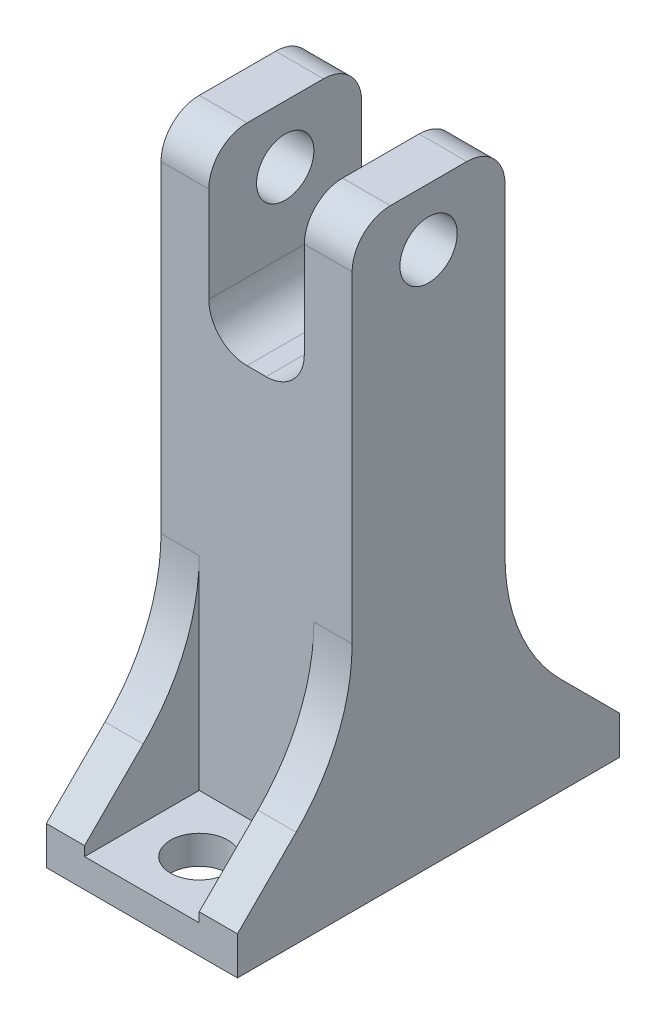
ISO-10303-21;
HEADER;
FILE_DESCRIPTION(('STEP AP214'),'2;1');
FILE_NAME('part.step','',(''),(''),'','','');
FILE_SCHEMA(('AUTOMOTIVE_DESIGN { 1 0 10303 214 1 1 1 1 }'));
ENDSEC;
DATA;
#1=APPLICATION_CONTEXT('core data for automotive mechanical design processes');
#2=APPLICATION_PROTOCOL_DEFINITION('international standard','automotive_design',2000,#1);
#3=PRODUCT_CONTEXT('',#1,'mechanical');
#4=PRODUCT('Part','Part','',(#3));
#5=PRODUCT_RELATED_PRODUCT_CATEGORY('part','',(#4));
#6=PRODUCT_DEFINITION_FORMATION('','',#4);
#7=PRODUCT_DEFINITION_CONTEXT('part definition',#1,'design');
#8=PRODUCT_DEFINITION('design','',#6,#7);
#9=PRODUCT_DEFINITION_SHAPE('','',#8);
#10=(LENGTH_UNIT() NAMED_UNIT(*) SI_UNIT(.MILLI.,.METRE.));
#11=(NAMED_UNIT(*) PLANE_ANGLE_UNIT() SI_UNIT($,.RADIAN.));
#12=(NAMED_UNIT(*) SI_UNIT($,.STERADIAN.) SOLID_ANGLE_UNIT());
#13=UNCERTAINTY_MEASURE_WITH_UNIT(LENGTH_MEASURE(1.E-05),#10,'distance_accuracy_value','');
#14=(GEOMETRIC_REPRESENTATION_CONTEXT(3) GLOBAL_UNCERTAINTY_ASSIGNED_CONTEXT((#13)) GLOBAL_UNIT_ASSIGNED_CONTEXT((#10,
#11,#12)) REPRESENTATION_CONTEXT('',''));
#15=CARTESIAN_POINT('',(0.,0.,0.));
#16=DIRECTION('',(0.,0.,1.));
#17=DIRECTION('',(1.,0.,0.));
#18=AXIS2_PLACEMENT_3D('',#15,#16,#17);
#19=CARTESIAN_POINT('',(5.,-13.5,10.));
#20=DIRECTION('',(0.,-0.707106781186548,-0.707106781186547));
#21=DIRECTION('',(0.,0.707106781186547,-0.707106781186548));
#22=AXIS2_PLACEMENT_3D('',#19,#20,#21);
#23=PLANE('',#22);
#24=DIRECTION('',(0.,0.707106781186547,-0.707106781186548));
#25=VECTOR('',#24,1.);
#26=CARTESIAN_POINT('',(-3.,-13.5,10.));
#27=LINE('',#26,#25);
#28=CARTESIAN_POINT('',(-3.,-13.5,10.));
#29=VERTEX_POINT('',#28);
#30=CARTESIAN_POINT('',(-3.,-10.4289321881345,6.92893218813453));
#31=VERTEX_POINT('',#30);
#32=EDGE_CURVE('E307',#29,#31,#27,.T.);
#33=ORIENTED_EDGE('',*,*,#32,.T.);
#34=DIRECTION('',(-1.,0.,0.));
#35=VECTOR('',#34,1.);
#36=CARTESIAN_POINT('',(-5.,-10.4289321881345,6.92893218813453));
#37=LINE('',#36,#35);
#38=CARTESIAN_POINT('',(-5.,-10.4289321881345,6.92893218813453));
#39=VERTEX_POINT('',#38);
#40=EDGE_CURVE('E420',#31,#39,#37,.T.);
#41=ORIENTED_EDGE('',*,*,#40,.T.);
#42=DIRECTION('',(0.,-0.707106781186547,0.707106781186548));
#43=VECTOR('',#42,1.);
#44=CARTESIAN_POINT('',(-5.,-13.5,10.));
#45=LINE('',#44,#43);
#46=CARTESIAN_POINT('',(-5.,-13.5,10.));
#47=VERTEX_POINT('',#46);
#48=EDGE_CURVE('E325',#39,#47,#45,.T.);
#49=ORIENTED_EDGE('',*,*,#48,.T.);
#50=DIRECTION('',(-1.,0.,0.));
#51=VECTOR('',#50,1.);
#52=CARTESIAN_POINT('',(5.,-13.5,10.));
#53=LINE('',#52,#51);
#54=EDGE_CURVE('E341',#29,#47,#53,.T.);
#55=ORIENTED_EDGE('',*,*,#54,.F.);
#56=EDGE_LOOP('',(#33,#41,#49,#55));
#57=FACE_BOUND('',#56,.T.);
#58=ADVANCED_FACE('F39',(#57),#23,.F.);
#59=CARTESIAN_POINT('',(5.,-13.5,-10.));
#60=DIRECTION('',(0.,-0.707106781186548,0.707106781186547));
#61=DIRECTION('',(0.,-0.707106781186547,-0.707106781186548));
#62=AXIS2_PLACEMENT_3D('',#59,#60,#61);
#63=PLANE('',#62);
#64=DIRECTION('',(0.,0.707106781186547,0.707106781186548));
#65=VECTOR('',#64,1.);
#66=CARTESIAN_POINT('',(-5.,-13.5,-10.));
#67=LINE('',#66,#65);
#68=CARTESIAN_POINT('',(-5.,-13.5,-10.));
#69=VERTEX_POINT('',#68);
#70=CARTESIAN_POINT('',(-5.,-10.4289321881345,-6.92893218813453));
#71=VERTEX_POINT('',#70);
#72=EDGE_CURVE('E321',#69,#71,#67,.T.);
#73=ORIENTED_EDGE('',*,*,#72,.T.);
#74=DIRECTION('',(-1.,0.,0.));
#75=VECTOR('',#74,1.);
#76=CARTESIAN_POINT('',(5.,-10.4289321881345,-6.92893218813453));
#77=LINE('',#76,#75);
#78=CARTESIAN_POINT('',(-3.,-10.4289321881345,-6.92893218813453));
#79=VERTEX_POINT('',#78);
#80=EDGE_CURVE('E410',#71,#79,#77,.F.);
#81=ORIENTED_EDGE('',*,*,#80,.T.);
#82=DIRECTION('',(0.,-0.707106781186547,-0.707106781186548));
#83=VECTOR('',#82,1.);
#84=CARTESIAN_POINT('',(-3.,-13.5,-10.));
#85=LINE('',#84,#83);
#86=CARTESIAN_POINT('',(-3.,-13.5,-10.));
#87=VERTEX_POINT('',#86);
#88=EDGE_CURVE('E303',#79,#87,#85,.T.);
#89=ORIENTED_EDGE('',*,*,#88,.T.);
#90=DIRECTION('',(-1.,0.,0.));
#91=VECTOR('',#90,1.);
#92=CARTESIAN_POINT('',(5.,-13.5,-10.));
#93=LINE('',#92,#91);
#94=EDGE_CURVE('E313',#87,#69,#93,.T.);
#95=ORIENTED_EDGE('',*,*,#94,.T.);
#96=EDGE_LOOP('',(#73,#81,#89,#95));
#97=FACE_BOUND('',#96,.T.);
#98=ADVANCED_FACE('F575',(#97),#63,.F.);
#99=CARTESIAN_POINT('',(0.,0.,-4.));
#100=DIRECTION('',(0.,0.,-1.));
#101=DIRECTION('',(-1.,0.,0.));
#102=AXIS2_PLACEMENT_3D('',#99,#100,#101);
#103=PLANE('',#102);
#104=DIRECTION('',(0.,-1.,0.));
#105=VECTOR('',#104,1.);
#106=CARTESIAN_POINT('',(-5.,-15.5,-4.));
#107=LINE('',#106,#105);
#108=CARTESIAN_POINT('',(-5.,13.5,-4.));
#109=VERTEX_POINT('',#108);
#110=CARTESIAN_POINT('',(-5.,-3.35786437626905,-4.));
#111=VERTEX_POINT('',#110);
#112=EDGE_CURVE('E361',#109,#111,#107,.T.);
#113=ORIENTED_EDGE('',*,*,#112,.F.);
#114=DIRECTION('',(-1.,0.,0.));
#115=VECTOR('',#114,1.);
#116=CARTESIAN_POINT('',(-2.5,13.5,-4.));
#117=LINE('',#116,#115);
#118=CARTESIAN_POINT('',(-2.5,13.5,-4.));
#119=VERTEX_POINT('',#118);
#120=EDGE_CURVE('E471',#109,#119,#117,.F.);
#121=ORIENTED_EDGE('',*,*,#120,.T.);
#122=DIRECTION('',(0.,1.,0.));
#123=VECTOR('',#122,1.);
#124=CARTESIAN_POINT('',(-2.5,6.5,-4.));
#125=LINE('',#124,#123);
#126=CARTESIAN_POINT('',(-2.5,8.5,-4.));
#127=VERTEX_POINT('',#126);
#128=EDGE_CURVE('E379',#127,#119,#125,.T.);
#129=ORIENTED_EDGE('',*,*,#128,.F.);
#130=CARTESIAN_POINT('',(-0.5,8.5,-4.));
#131=DIRECTION('',(0.,0.,-1.));
#132=DIRECTION('',(-1.,0.,0.));
#133=AXIS2_PLACEMENT_3D('',#130,#131,#132);
#134=CIRCLE('',#133,2.);
#135=CARTESIAN_POINT('',(-0.5,6.5,-4.));
#136=VERTEX_POINT('',#135);
#137=EDGE_CURVE('E456',#127,#136,#134,.F.);
#138=ORIENTED_EDGE('',*,*,#137,.T.);
#139=DIRECTION('',(-1.,0.,0.));
#140=VECTOR('',#139,1.);
#141=CARTESIAN_POINT('',(-2.5,6.5,-4.));
#142=LINE('',#141,#140);
#143=CARTESIAN_POINT('',(0.5,6.5,-4.));
#144=VERTEX_POINT('',#143);
#145=EDGE_CURVE('E376',#144,#136,#142,.T.);
#146=ORIENTED_EDGE('',*,*,#145,.F.);
#147=CARTESIAN_POINT('',(0.5,8.5,-4.));
#148=DIRECTION('',(0.,0.,-1.));
#149=DIRECTION('',(-1.,0.,0.));
#150=AXIS2_PLACEMENT_3D('',#147,#148,#149);
#151=CIRCLE('',#150,2.);
#152=CARTESIAN_POINT('',(2.5,8.5,-4.));
#153=VERTEX_POINT('',#152);
#154=EDGE_CURVE('E451',#144,#153,#151,.F.);
#155=ORIENTED_EDGE('',*,*,#154,.T.);
#156=DIRECTION('',(0.,-1.,0.));
#157=VECTOR('',#156,1.);
#158=CARTESIAN_POINT('',(2.5,6.5,-4.));
#159=LINE('',#158,#157);
#160=CARTESIAN_POINT('',(2.5,13.5,-4.));
#161=VERTEX_POINT('',#160);
#162=EDGE_CURVE('E374',#161,#153,#159,.T.);
#163=ORIENTED_EDGE('',*,*,#162,.F.);
#164=DIRECTION('',(-1.,0.,0.));
#165=VECTOR('',#164,1.);
#166=CARTESIAN_POINT('',(5.,13.5,-4.));
#167=LINE('',#166,#165);
#168=CARTESIAN_POINT('',(5.,13.5,-4.));
#169=VERTEX_POINT('',#168);
#170=EDGE_CURVE('E469',#161,#169,#167,.F.);
#171=ORIENTED_EDGE('',*,*,#170,.T.);
#172=DIRECTION('',(0.,1.,0.));
#173=VECTOR('',#172,1.);
#174=CARTESIAN_POINT('',(5.,-15.5,-4.));
#175=LINE('',#174,#173);
#176=CARTESIAN_POINT('',(5.,-3.35786437626905,-4.));
#177=VERTEX_POINT('',#176);
#178=EDGE_CURVE('E357',#177,#169,#175,.T.);
#179=ORIENTED_EDGE('',*,*,#178,.F.);
#180=DIRECTION('',(-1.,0.,0.));
#181=VECTOR('',#180,1.);
#182=CARTESIAN_POINT('',(0.,-3.35786437626905,-4.));
#183=LINE('',#182,#181);
#184=CARTESIAN_POINT('',(3.,-3.35786437626905,-4.));
#185=VERTEX_POINT('',#184);
#186=EDGE_CURVE('E406',#177,#185,#183,.T.);
#187=ORIENTED_EDGE('',*,*,#186,.T.);
#188=DIRECTION('',(0.,1.,0.));
#189=VECTOR('',#188,1.);
#190=CARTESIAN_POINT('',(3.,-14.,-4.));
#191=LINE('',#190,#189);
#192=CARTESIAN_POINT('',(3.,-14.,-4.));
#193=VERTEX_POINT('',#192);
#194=EDGE_CURVE('E250',#193,#185,#191,.T.);
#195=ORIENTED_EDGE('',*,*,#194,.F.);
#196=DIRECTION('',(1.,0.,0.));
#197=VECTOR('',#196,1.);
#198=CARTESIAN_POINT('',(-3.,-14.,-4.));
#199=LINE('',#198,#197);
#200=CARTESIAN_POINT('',(-3.,-14.,-4.));
#201=VERTEX_POINT('',#200);
#202=EDGE_CURVE('E254',#201,#193,#199,.T.);
#203=ORIENTED_EDGE('',*,*,#202,.F.);
#204=DIRECTION('',(0.,1.,0.));
#205=VECTOR('',#204,1.);
#206=CARTESIAN_POINT('',(-3.,-14.,-4.));
#207=LINE('',#206,#205);
#208=CARTESIAN_POINT('',(-3.,-3.35786437626905,-4.));
#209=VERTEX_POINT('',#208);
#210=EDGE_CURVE('E237',#201,#209,#207,.T.);
#211=ORIENTED_EDGE('',*,*,#210,.T.);
#212=DIRECTION('',(-1.,0.,0.));
#213=VECTOR('',#212,1.);
#214=CARTESIAN_POINT('',(0.,-3.35786437626905,-4.));
#215=LINE('',#214,#213);
#216=EDGE_CURVE('E398',#209,#111,#215,.T.);
#217=ORIENTED_EDGE('',*,*,#216,.T.);
#218=EDGE_LOOP('',(#113,#121,#129,#138,#146,#155,#163,#171,#179,#187,#195,#203,#211,#217));
#219=FACE_BOUND('',#218,.T.);
#220=ADVANCED_FACE('F256',(#219),#103,.T.);
#221=CARTESIAN_POINT('',(0.,0.,4.));
#222=DIRECTION('',(0.,0.,-1.));
#223=DIRECTION('',(-1.,0.,0.));
#224=AXIS2_PLACEMENT_3D('',#221,#222,#223);
#225=PLANE('',#224);
#226=DIRECTION('',(0.,1.,0.));
#227=VECTOR('',#226,1.);
#228=CARTESIAN_POINT('',(5.,-15.5,4.));
#229=LINE('',#228,#227);
#230=CARTESIAN_POINT('',(5.,-3.35786437626905,4.));
#231=VERTEX_POINT('',#230);
#232=CARTESIAN_POINT('',(5.,13.5,4.));
#233=VERTEX_POINT('',#232);
#234=EDGE_CURVE('E358',#231,#233,#229,.T.);
#235=ORIENTED_EDGE('',*,*,#234,.T.);
#236=DIRECTION('',(-1.,0.,0.));
#237=VECTOR('',#236,1.);
#238=CARTESIAN_POINT('',(0.,13.5,4.));
#239=LINE('',#238,#237);
#240=CARTESIAN_POINT('',(2.5,13.5,4.));
#241=VERTEX_POINT('',#240);
#242=EDGE_CURVE('E11',#233,#241,#239,.T.);
#243=ORIENTED_EDGE('',*,*,#242,.T.);
#244=DIRECTION('',(0.,-1.,0.));
#245=VECTOR('',#244,1.);
#246=CARTESIAN_POINT('',(2.5,6.5,4.));
#247=LINE('',#246,#245);
#248=CARTESIAN_POINT('',(2.5,8.5,4.));
#249=VERTEX_POINT('',#248);
#250=EDGE_CURVE('E360',#241,#249,#247,.T.);
#251=ORIENTED_EDGE('',*,*,#250,.T.);
#252=CARTESIAN_POINT('',(0.5,8.5,4.));
#253=DIRECTION('',(0.,0.,-1.));
#254=DIRECTION('',(-1.,0.,0.));
#255=AXIS2_PLACEMENT_3D('',#252,#253,#254);
#256=CIRCLE('',#255,2.);
#257=CARTESIAN_POINT('',(0.5,6.5,4.));
#258=VERTEX_POINT('',#257);
#259=EDGE_CURVE('E454',#249,#258,#256,.T.);
#260=ORIENTED_EDGE('',*,*,#259,.T.);
#261=DIRECTION('',(-1.,0.,0.));
#262=VECTOR('',#261,1.);
#263=CARTESIAN_POINT('',(-2.5,6.5,4.));
#264=LINE('',#263,#262);
#265=CARTESIAN_POINT('',(-0.5,6.5,4.));
#266=VERTEX_POINT('',#265);
#267=EDGE_CURVE('E363',#258,#266,#264,.T.);
#268=ORIENTED_EDGE('',*,*,#267,.T.);
#269=CARTESIAN_POINT('',(-0.5,8.5,4.));
#270=DIRECTION('',(0.,0.,-1.));
#271=DIRECTION('',(-1.,0.,0.));
#272=AXIS2_PLACEMENT_3D('',#269,#270,#271);
#273=CIRCLE('',#272,2.);
#274=CARTESIAN_POINT('',(-2.5,8.5,4.));
#275=VERTEX_POINT('',#274);
#276=EDGE_CURVE('E458',#266,#275,#273,.T.);
#277=ORIENTED_EDGE('',*,*,#276,.T.);
#278=DIRECTION('',(0.,1.,0.));
#279=VECTOR('',#278,1.);
#280=CARTESIAN_POINT('',(-2.5,6.5,4.));
#281=LINE('',#280,#279);
#282=CARTESIAN_POINT('',(-2.5,13.5,4.));
#283=VERTEX_POINT('',#282);
#284=EDGE_CURVE('E366',#275,#283,#281,.T.);
#285=ORIENTED_EDGE('',*,*,#284,.T.);
#286=DIRECTION('',(-1.,0.,0.));
#287=VECTOR('',#286,1.);
#288=CARTESIAN_POINT('',(0.,13.5,4.));
#289=LINE('',#288,#287);
#290=CARTESIAN_POINT('',(-5.,13.5,4.));
#291=VERTEX_POINT('',#290);
#292=EDGE_CURVE('E47',#283,#291,#289,.T.);
#293=ORIENTED_EDGE('',*,*,#292,.T.);
#294=DIRECTION('',(0.,-1.,0.));
#295=VECTOR('',#294,1.);
#296=CARTESIAN_POINT('',(-5.,-15.5,4.));
#297=LINE('',#296,#295);
#298=CARTESIAN_POINT('',(-5.,-3.35786437626905,4.));
#299=VERTEX_POINT('',#298);
#300=EDGE_CURVE('E369',#291,#299,#297,.T.);
#301=ORIENTED_EDGE('',*,*,#300,.T.);
#302=DIRECTION('',(-1.,0.,0.));
#303=VECTOR('',#302,1.);
#304=CARTESIAN_POINT('',(-3.,-3.35786437626905,4.));
#305=LINE('',#304,#303);
#306=CARTESIAN_POINT('',(-3.,-3.35786437626905,4.));
#307=VERTEX_POINT('',#306);
#308=EDGE_CURVE('E415',#299,#307,#305,.F.);
#309=ORIENTED_EDGE('',*,*,#308,.T.);
#310=DIRECTION('',(0.,1.,0.));
#311=VECTOR('',#310,1.);
#312=CARTESIAN_POINT('',(-3.,-14.,4.));
#313=LINE('',#312,#311);
#314=CARTESIAN_POINT('',(-3.,-14.,4.));
#315=VERTEX_POINT('',#314);
#316=EDGE_CURVE('E289',#315,#307,#313,.T.);
#317=ORIENTED_EDGE('',*,*,#316,.F.);
#318=DIRECTION('',(-1.,0.,0.));
#319=VECTOR('',#318,1.);
#320=CARTESIAN_POINT('',(-3.,-14.,4.));
#321=LINE('',#320,#319);
#322=CARTESIAN_POINT('',(3.,-14.,4.));
#323=VERTEX_POINT('',#322);
#324=EDGE_CURVE('E296',#323,#315,#321,.T.);
#325=ORIENTED_EDGE('',*,*,#324,.F.);
#326=DIRECTION('',(0.,1.,0.));
#327=VECTOR('',#326,1.);
#328=CARTESIAN_POINT('',(3.,-14.,4.));
#329=LINE('',#328,#327);
#330=CARTESIAN_POINT('',(3.,-3.35786437626905,4.));
#331=VERTEX_POINT('',#330);
#332=EDGE_CURVE('E287',#323,#331,#329,.T.);
#333=ORIENTED_EDGE('',*,*,#332,.T.);
#334=DIRECTION('',(-1.,0.,0.));
#335=VECTOR('',#334,1.);
#336=CARTESIAN_POINT('',(5.,-3.35786437626905,4.));
#337=LINE('',#336,#335);
#338=EDGE_CURVE('E418',#331,#231,#337,.F.);
#339=ORIENTED_EDGE('',*,*,#338,.T.);
#340=EDGE_LOOP('',(#235,#243,#251,#260,#268,#277,#285,#293,#301,#309,#317,#325,#333,#339));
#341=FACE_BOUND('',#340,.T.);
#342=ADVANCED_FACE('F491',(#341),#225,.F.);
#343=CARTESIAN_POINT('',(5.,-15.5,4.));
#344=DIRECTION('',(-1.,0.,0.));
#345=DIRECTION('',(0.,0.,1.));
#346=AXIS2_PLACEMENT_3D('',#343,#344,#345);
#347=PLANE('',#346);
#348=CARTESIAN_POINT('',(5.,12.5,0.));
#349=DIRECTION('',(1.,0.,0.));
#350=DIRECTION('',(0.,0.,-1.));
#351=AXIS2_PLACEMENT_3D('',#348,#349,#350);
#352=CIRCLE('',#351,1.5);
#353=CARTESIAN_POINT('',(5.,12.5,-1.5));
#354=VERTEX_POINT('',#353);
#355=EDGE_CURVE('E345',#354,#354,#352,.T.);
#356=ORIENTED_EDGE('',*,*,#355,.F.);
#357=EDGE_LOOP('',(#356));
#358=FACE_BOUND('',#357,.T.);
#359=ORIENTED_EDGE('',*,*,#178,.T.);
#360=CARTESIAN_POINT('',(5.,13.5,-2.));
#361=DIRECTION('',(-1.,0.,0.));
#362=DIRECTION('',(0.,0.,1.));
#363=AXIS2_PLACEMENT_3D('',#360,#361,#362);
#364=CIRCLE('',#363,2.);
#365=CARTESIAN_POINT('',(5.,15.5,-2.));
#366=VERTEX_POINT('',#365);
#367=EDGE_CURVE('E486',#169,#366,#364,.F.);
#368=ORIENTED_EDGE('',*,*,#367,.T.);
#369=DIRECTION('',(0.,0.,-1.));
#370=VECTOR('',#369,1.);
#371=CARTESIAN_POINT('',(5.,15.5,4.));
#372=LINE('',#371,#370);
#373=CARTESIAN_POINT('',(5.,15.5,2.));
#374=VERTEX_POINT('',#373);
#375=EDGE_CURVE('E395',#374,#366,#372,.T.);
#376=ORIENTED_EDGE('',*,*,#375,.F.);
#377=CARTESIAN_POINT('',(5.,13.5,2.));
#378=DIRECTION('',(-1.,0.,0.));
#379=DIRECTION('',(0.,0.,1.));
#380=AXIS2_PLACEMENT_3D('',#377,#378,#379);
#381=CIRCLE('',#380,2.);
#382=EDGE_CURVE('E54',#374,#233,#381,.F.);
#383=ORIENTED_EDGE('',*,*,#382,.T.);
#384=ORIENTED_EDGE('',*,*,#234,.F.);
#385=CARTESIAN_POINT('',(5.,-3.35786437626905,14.));
#386=DIRECTION('',(-1.,0.,0.));
#387=DIRECTION('',(0.,0.,1.));
#388=AXIS2_PLACEMENT_3D('',#385,#386,#387);
#389=CIRCLE('',#388,10.);
#390=CARTESIAN_POINT('',(5.,-10.4289321881345,6.92893218813453));
#391=VERTEX_POINT('',#390);
#392=EDGE_CURVE('E433',#231,#391,#389,.T.);
#393=ORIENTED_EDGE('',*,*,#392,.T.);
#394=DIRECTION('',(0.,-0.707106781186547,0.707106781186548));
#395=VECTOR('',#394,1.);
#396=CARTESIAN_POINT('',(5.,-13.5,10.));
#397=LINE('',#396,#395);
#398=CARTESIAN_POINT('',(5.,-13.5,10.));
#399=VERTEX_POINT('',#398);
#400=EDGE_CURVE('E329',#391,#399,#397,.T.);
#401=ORIENTED_EDGE('',*,*,#400,.T.);
#402=DIRECTION('',(0.,-1.,0.));
#403=VECTOR('',#402,1.);
#404=CARTESIAN_POINT('',(5.,-15.5,10.));
#405=LINE('',#404,#403);
#406=CARTESIAN_POINT('',(5.,-15.5,10.));
#407=VERTEX_POINT('',#406);
#408=EDGE_CURVE('E331',#399,#407,#405,.T.);
#409=ORIENTED_EDGE('',*,*,#408,.T.);
#410=DIRECTION('',(0.,0.,-1.));
#411=VECTOR('',#410,1.);
#412=CARTESIAN_POINT('',(5.,-15.5,4.));
#413=LINE('',#412,#411);
#414=CARTESIAN_POINT('',(5.,-15.5,-10.));
#415=VERTEX_POINT('',#414);
#416=EDGE_CURVE('E371',#407,#415,#413,.T.);
#417=ORIENTED_EDGE('',*,*,#416,.T.);
#418=DIRECTION('',(0.,1.,0.));
#419=VECTOR('',#418,1.);
#420=CARTESIAN_POINT('',(5.,-15.5,-10.));
#421=LINE('',#420,#419);
#422=CARTESIAN_POINT('',(5.,-13.5,-10.));
#423=VERTEX_POINT('',#422);
#424=EDGE_CURVE('E317',#415,#423,#421,.T.);
#425=ORIENTED_EDGE('',*,*,#424,.T.);
#426=DIRECTION('',(0.,0.707106781186547,0.707106781186548));
#427=VECTOR('',#426,1.);
#428=CARTESIAN_POINT('',(5.,-13.5,-10.));
#429=LINE('',#428,#427);
#430=CARTESIAN_POINT('',(5.,-10.4289321881345,-6.92893218813453));
#431=VERTEX_POINT('',#430);
#432=EDGE_CURVE('E322',#423,#431,#429,.T.);
#433=ORIENTED_EDGE('',*,*,#432,.T.);
#434=CARTESIAN_POINT('',(5.,-3.35786437626905,-14.));
#435=DIRECTION('',(-1.,0.,0.));
#436=DIRECTION('',(0.,0.,1.));
#437=AXIS2_PLACEMENT_3D('',#434,#435,#436);
#438=CIRCLE('',#437,10.);
#439=EDGE_CURVE('E425',#431,#177,#438,.T.);
#440=ORIENTED_EDGE('',*,*,#439,.T.);
#441=EDGE_LOOP('',(#359,#368,#376,#383,#384,#393,#401,#409,#417,#425,#433,#440));
#442=FACE_BOUND('',#441,.T.);
#443=ADVANCED_FACE('F526',(#358,#442),#347,.F.);
#444=CARTESIAN_POINT('',(2.5,15.5,4.));
#445=DIRECTION('',(0.,-1.,0.));
#446=DIRECTION('',(1.,0.,0.));
#447=AXIS2_PLACEMENT_3D('',#444,#445,#446);
#448=PLANE('',#447);
#449=ORIENTED_EDGE('',*,*,#375,.T.);
#450=DIRECTION('',(-1.,0.,0.));
#451=VECTOR('',#450,1.);
#452=CARTESIAN_POINT('',(2.5,15.5,-2.));
#453=LINE('',#452,#451);
#454=CARTESIAN_POINT('',(2.5,15.5,-2.));
#455=VERTEX_POINT('',#454);
#456=EDGE_CURVE('E479',#366,#455,#453,.T.);
#457=ORIENTED_EDGE('',*,*,#456,.T.);
#458=DIRECTION('',(0.,0.,-1.));
#459=VECTOR('',#458,1.);
#460=CARTESIAN_POINT('',(2.5,15.5,4.));
#461=LINE('',#460,#459);
#462=CARTESIAN_POINT('',(2.5,15.5,2.));
#463=VERTEX_POINT('',#462);
#464=EDGE_CURVE('E392',#463,#455,#461,.T.);
#465=ORIENTED_EDGE('',*,*,#464,.F.);
#466=DIRECTION('',(-1.,0.,0.));
#467=VECTOR('',#466,1.);
#468=CARTESIAN_POINT('',(2.5,15.5,2.));
#469=LINE('',#468,#467);
#470=EDGE_CURVE('E477',#463,#374,#469,.F.);
#471=ORIENTED_EDGE('',*,*,#470,.T.);
#472=EDGE_LOOP('',(#449,#457,#465,#471));
#473=FACE_BOUND('',#472,.T.);
#474=ADVANCED_FACE('F559',(#473),#448,.F.);
#475=CARTESIAN_POINT('',(2.5,6.5,4.));
#476=DIRECTION('',(1.,0.,0.));
#477=DIRECTION('',(0.,0.,-1.));
#478=AXIS2_PLACEMENT_3D('',#475,#476,#477);
#479=PLANE('',#478);
#480=CARTESIAN_POINT('',(2.5,12.5,0.));
#481=DIRECTION('',(1.,0.,0.));
#482=DIRECTION('',(0.,0.,-1.));
#483=AXIS2_PLACEMENT_3D('',#480,#481,#482);
#484=CIRCLE('',#483,1.5);
#485=CARTESIAN_POINT('',(2.5,12.5,-1.5));
#486=VERTEX_POINT('',#485);
#487=EDGE_CURVE('E354',#486,#486,#484,.T.);
#488=ORIENTED_EDGE('',*,*,#487,.T.);
#489=EDGE_LOOP('',(#488));
#490=FACE_BOUND('',#489,.T.);
#491=ORIENTED_EDGE('',*,*,#464,.T.);
#492=CARTESIAN_POINT('',(2.5,13.5,-2.));
#493=DIRECTION('',(1.,0.,0.));
#494=DIRECTION('',(0.,0.,-1.));
#495=AXIS2_PLACEMENT_3D('',#492,#493,#494);
#496=CIRCLE('',#495,2.);
#497=EDGE_CURVE('E483',#455,#161,#496,.F.);
#498=ORIENTED_EDGE('',*,*,#497,.T.);
#499=ORIENTED_EDGE('',*,*,#162,.T.);
#500=DIRECTION('',(0.,0.,-1.));
#501=VECTOR('',#500,1.);
#502=CARTESIAN_POINT('',(2.5,8.5,4.));
#503=LINE('',#502,#501);
#504=EDGE_CURVE('E445',#153,#249,#503,.F.);
#505=ORIENTED_EDGE('',*,*,#504,.T.);
#506=ORIENTED_EDGE('',*,*,#250,.F.);
#507=CARTESIAN_POINT('',(2.5,13.5,2.));
#508=DIRECTION('',(1.,0.,0.));
#509=DIRECTION('',(0.,0.,-1.));
#510=AXIS2_PLACEMENT_3D('',#507,#508,#509);
#511=CIRCLE('',#510,2.);
#512=EDGE_CURVE('E62',#241,#463,#511,.F.);
#513=ORIENTED_EDGE('',*,*,#512,.T.);
#514=EDGE_LOOP('',(#491,#498,#499,#505,#506,#513));
#515=FACE_BOUND('',#514,.T.);
#516=ADVANCED_FACE('F561',(#490,#515),#479,.F.);
#517=CARTESIAN_POINT('',(-2.5,6.5,4.));
#518=DIRECTION('',(0.,-1.,0.));
#519=DIRECTION('',(0.,0.,-1.));
#520=AXIS2_PLACEMENT_3D('',#517,#518,#519);
#521=PLANE('',#520);
#522=ORIENTED_EDGE('',*,*,#267,.F.);
#523=DIRECTION('',(0.,0.,-1.));
#524=VECTOR('',#523,1.);
#525=CARTESIAN_POINT('',(0.5,6.5,-4.));
#526=LINE('',#525,#524);
#527=EDGE_CURVE('E442',#258,#144,#526,.T.);
#528=ORIENTED_EDGE('',*,*,#527,.T.);
#529=ORIENTED_EDGE('',*,*,#145,.T.);
#530=DIRECTION('',(0.,0.,-1.));
#531=VECTOR('',#530,1.);
#532=CARTESIAN_POINT('',(-0.5,6.5,4.));
#533=LINE('',#532,#531);
#534=EDGE_CURVE('E440',#136,#266,#533,.F.);
#535=ORIENTED_EDGE('',*,*,#534,.T.);
#536=EDGE_LOOP('',(#522,#528,#529,#535));
#537=FACE_BOUND('',#536,.T.);
#538=ADVANCED_FACE('F619',(#537),#521,.F.);
#539=CARTESIAN_POINT('',(-2.5,6.5,4.));
#540=DIRECTION('',(-1.,0.,0.));
#541=DIRECTION('',(0.,0.,1.));
#542=AXIS2_PLACEMENT_3D('',#539,#540,#541);
#543=PLANE('',#542);
#544=CARTESIAN_POINT('',(-2.5,12.5,0.));
#545=DIRECTION('',(-1.,0.,0.));
#546=DIRECTION('',(0.,0.,1.));
#547=AXIS2_PLACEMENT_3D('',#544,#545,#546);
#548=CIRCLE('',#547,1.5);
#549=CARTESIAN_POINT('',(-2.5,12.5,1.5));
#550=VERTEX_POINT('',#549);
#551=EDGE_CURVE('E349',#550,#550,#548,.T.);
#552=ORIENTED_EDGE('',*,*,#551,.T.);
#553=EDGE_LOOP('',(#552));
#554=FACE_BOUND('',#553,.T.);
#555=ORIENTED_EDGE('',*,*,#128,.T.);
#556=CARTESIAN_POINT('',(-2.5,13.5,-2.));
#557=DIRECTION('',(-1.,0.,0.));
#558=DIRECTION('',(0.,0.,1.));
#559=AXIS2_PLACEMENT_3D('',#556,#557,#558);
#560=CIRCLE('',#559,2.);
#561=CARTESIAN_POINT('',(-2.5,15.5,-2.));
#562=VERTEX_POINT('',#561);
#563=EDGE_CURVE('E475',#119,#562,#560,.F.);
#564=ORIENTED_EDGE('',*,*,#563,.T.);
#565=DIRECTION('',(0.,0.,-1.));
#566=VECTOR('',#565,1.);
#567=CARTESIAN_POINT('',(-2.5,15.5,4.));
#568=LINE('',#567,#566);
#569=CARTESIAN_POINT('',(-2.5,15.5,2.));
#570=VERTEX_POINT('',#569);
#571=EDGE_CURVE('E389',#570,#562,#568,.T.);
#572=ORIENTED_EDGE('',*,*,#571,.F.);
#573=CARTESIAN_POINT('',(-2.5,13.5,2.));
#574=DIRECTION('',(-1.,0.,0.));
#575=DIRECTION('',(0.,0.,1.));
#576=AXIS2_PLACEMENT_3D('',#573,#574,#575);
#577=CIRCLE('',#576,2.);
#578=EDGE_CURVE('E473',#570,#283,#577,.F.);
#579=ORIENTED_EDGE('',*,*,#578,.T.);
#580=ORIENTED_EDGE('',*,*,#284,.F.);
#581=DIRECTION('',(0.,0.,-1.));
#582=VECTOR('',#581,1.);
#583=CARTESIAN_POINT('',(-2.5,8.5,-4.));
#584=LINE('',#583,#582);
#585=EDGE_CURVE('E448',#275,#127,#584,.T.);
#586=ORIENTED_EDGE('',*,*,#585,.T.);
#587=EDGE_LOOP('',(#555,#564,#572,#579,#580,#586));
#588=FACE_BOUND('',#587,.T.);
#589=ADVANCED_FACE('F615',(#554,#588),#543,.F.);
#590=CARTESIAN_POINT('',(-5.,15.5,4.));
#591=DIRECTION('',(0.,-1.,0.));
#592=DIRECTION('',(1.,0.,0.));
#593=AXIS2_PLACEMENT_3D('',#590,#591,#592);
#594=PLANE('',#593);
#595=ORIENTED_EDGE('',*,*,#571,.T.);
#596=DIRECTION('',(-1.,0.,0.));
#597=VECTOR('',#596,1.);
#598=CARTESIAN_POINT('',(-5.,15.5,-2.));
#599=LINE('',#598,#597);
#600=CARTESIAN_POINT('',(-5.,15.5,-2.));
#601=VERTEX_POINT('',#600);
#602=EDGE_CURVE('E462',#562,#601,#599,.T.);
#603=ORIENTED_EDGE('',*,*,#602,.T.);
#604=DIRECTION('',(0.,0.,-1.));
#605=VECTOR('',#604,1.);
#606=CARTESIAN_POINT('',(-5.,15.5,4.));
#607=LINE('',#606,#605);
#608=CARTESIAN_POINT('',(-5.,15.5,2.));
#609=VERTEX_POINT('',#608);
#610=EDGE_CURVE('E386',#609,#601,#607,.T.);
#611=ORIENTED_EDGE('',*,*,#610,.F.);
#612=DIRECTION('',(-1.,0.,0.));
#613=VECTOR('',#612,1.);
#614=CARTESIAN_POINT('',(-5.,15.5,2.));
#615=LINE('',#614,#613);
#616=EDGE_CURVE('E460',#609,#570,#615,.F.);
#617=ORIENTED_EDGE('',*,*,#616,.T.);
#618=EDGE_LOOP('',(#595,#603,#611,#617));
#619=FACE_BOUND('',#618,.T.);
#620=ADVANCED_FACE('F611',(#619),#594,.F.);
#621=CARTESIAN_POINT('',(-5.,-15.5,4.));
#622=DIRECTION('',(1.,0.,0.));
#623=DIRECTION('',(0.,0.,-1.));
#624=AXIS2_PLACEMENT_3D('',#621,#622,#623);
#625=PLANE('',#624);
#626=CARTESIAN_POINT('',(-5.,12.5,0.));
#627=DIRECTION('',(1.,0.,0.));
#628=DIRECTION('',(0.,0.,-1.));
#629=AXIS2_PLACEMENT_3D('',#626,#627,#628);
#630=CIRCLE('',#629,1.5);
#631=CARTESIAN_POINT('',(-5.,12.5,-1.5));
#632=VERTEX_POINT('',#631);
#633=EDGE_CURVE('E346',#632,#632,#630,.T.);
#634=ORIENTED_EDGE('',*,*,#633,.T.);
#635=EDGE_LOOP('',(#634));
#636=FACE_BOUND('',#635,.T.);
#637=ORIENTED_EDGE('',*,*,#610,.T.);
#638=CARTESIAN_POINT('',(-5.,13.5,-2.));
#639=DIRECTION('',(1.,0.,0.));
#640=DIRECTION('',(0.,0.,-1.));
#641=AXIS2_PLACEMENT_3D('',#638,#639,#640);
#642=CIRCLE('',#641,2.);
#643=EDGE_CURVE('E467',#601,#109,#642,.F.);
#644=ORIENTED_EDGE('',*,*,#643,.T.);
#645=ORIENTED_EDGE('',*,*,#112,.T.);
#646=CARTESIAN_POINT('',(-5.,-3.35786437626905,-14.));
#647=DIRECTION('',(1.,0.,0.));
#648=DIRECTION('',(0.,0.,-1.));
#649=AXIS2_PLACEMENT_3D('',#646,#647,#648);
#650=CIRCLE('',#649,10.);
#651=EDGE_CURVE('E427',#111,#71,#650,.T.);
#652=ORIENTED_EDGE('',*,*,#651,.T.);
#653=ORIENTED_EDGE('',*,*,#72,.F.);
#654=DIRECTION('',(0.,1.,0.));
#655=VECTOR('',#654,1.);
#656=CARTESIAN_POINT('',(-5.,-15.5,-10.));
#657=LINE('',#656,#655);
#658=CARTESIAN_POINT('',(-5.,-15.5,-10.));
#659=VERTEX_POINT('',#658);
#660=EDGE_CURVE('E318',#659,#69,#657,.T.);
#661=ORIENTED_EDGE('',*,*,#660,.F.);
#662=DIRECTION('',(0.,0.,-1.));
#663=VECTOR('',#662,1.);
#664=CARTESIAN_POINT('',(-5.,-15.5,4.));
#665=LINE('',#664,#663);
#666=CARTESIAN_POINT('',(-5.,-15.5,10.));
#667=VERTEX_POINT('',#666);
#668=EDGE_CURVE('E384',#667,#659,#665,.T.);
#669=ORIENTED_EDGE('',*,*,#668,.F.);
#670=DIRECTION('',(0.,-1.,0.));
#671=VECTOR('',#670,1.);
#672=CARTESIAN_POINT('',(-5.,-15.5,10.));
#673=LINE('',#672,#671);
#674=EDGE_CURVE('E332',#47,#667,#673,.T.);
#675=ORIENTED_EDGE('',*,*,#674,.F.);
#676=ORIENTED_EDGE('',*,*,#48,.F.);
#677=CARTESIAN_POINT('',(-5.,-3.35786437626905,14.));
#678=DIRECTION('',(1.,0.,0.));
#679=DIRECTION('',(0.,0.,-1.));
#680=AXIS2_PLACEMENT_3D('',#677,#678,#679);
#681=CIRCLE('',#680,10.);
#682=EDGE_CURVE('E435',#39,#299,#681,.T.);
#683=ORIENTED_EDGE('',*,*,#682,.T.);
#684=ORIENTED_EDGE('',*,*,#300,.F.);
#685=CARTESIAN_POINT('',(-5.,13.5,2.));
#686=DIRECTION('',(1.,0.,0.));
#687=DIRECTION('',(0.,0.,-1.));
#688=AXIS2_PLACEMENT_3D('',#685,#686,#687);
#689=CIRCLE('',#688,2.);
#690=EDGE_CURVE('E465',#291,#609,#689,.F.);
#691=ORIENTED_EDGE('',*,*,#690,.T.);
#692=EDGE_LOOP('',(#637,#644,#645,#652,#653,#661,#669,#675,#676,#683,#684,#691));
#693=FACE_BOUND('',#692,.T.);
#694=ADVANCED_FACE('F496',(#636,#693),#625,.F.);
#695=CARTESIAN_POINT('',(-5.,-15.5,4.));
#696=DIRECTION('',(0.,1.,0.));
#697=DIRECTION('',(0.,0.,1.));
#698=AXIS2_PLACEMENT_3D('',#695,#696,#697);
#699=PLANE('',#698);
#700=CARTESIAN_POINT('',(0.,-15.5,-7.));
#701=DIRECTION('',(0.,1.,0.));
#702=DIRECTION('',(0.,0.,1.));
#703=AXIS2_PLACEMENT_3D('',#700,#701,#702);
#704=CIRCLE('',#703,1.5);
#705=CARTESIAN_POINT('',(0.,-15.5,-5.5));
#706=VERTEX_POINT('',#705);
#707=EDGE_CURVE('E402',#706,#706,#704,.T.);
#708=ORIENTED_EDGE('',*,*,#707,.T.);
#709=EDGE_LOOP('',(#708));
#710=FACE_BOUND('',#709,.T.);
#711=CARTESIAN_POINT('',(0.,-15.5,7.));
#712=DIRECTION('',(0.,1.,0.));
#713=DIRECTION('',(0.,0.,-1.));
#714=AXIS2_PLACEMENT_3D('',#711,#712,#713);
#715=CIRCLE('',#714,1.5);
#716=CARTESIAN_POINT('',(0.,-15.5,5.5));
#717=VERTEX_POINT('',#716);
#718=EDGE_CURVE('E271',#717,#717,#715,.T.);
#719=ORIENTED_EDGE('',*,*,#718,.T.);
#720=EDGE_LOOP('',(#719));
#721=FACE_BOUND('',#720,.T.);
#722=ORIENTED_EDGE('',*,*,#668,.T.);
#723=DIRECTION('',(-1.,0.,0.));
#724=VECTOR('',#723,1.);
#725=CARTESIAN_POINT('',(5.,-15.5,-10.));
#726=LINE('',#725,#724);
#727=EDGE_CURVE('E310',#415,#659,#726,.T.);
#728=ORIENTED_EDGE('',*,*,#727,.F.);
#729=ORIENTED_EDGE('',*,*,#416,.F.);
#730=DIRECTION('',(-1.,0.,0.));
#731=VECTOR('',#730,1.);
#732=CARTESIAN_POINT('',(5.,-15.5,10.));
#733=LINE('',#732,#731);
#734=EDGE_CURVE('E335',#407,#667,#733,.T.);
#735=ORIENTED_EDGE('',*,*,#734,.T.);
#736=EDGE_LOOP('',(#722,#728,#729,#735));
#737=FACE_BOUND('',#736,.T.);
#738=ADVANCED_FACE('F535',(#710,#721,#737),#699,.F.);
#739=CARTESIAN_POINT('',(-5.,12.5,0.));
#740=DIRECTION('',(1.,0.,0.));
#741=DIRECTION('',(0.,0.,-1.));
#742=AXIS2_PLACEMENT_3D('',#739,#740,#741);
#743=CYLINDRICAL_SURFACE('',#742,1.5);
#744=ORIENTED_EDGE('',*,*,#633,.F.);
#745=EDGE_LOOP('',(#744));
#746=FACE_BOUND('',#745,.T.);
#747=ORIENTED_EDGE('',*,*,#551,.F.);
#748=EDGE_LOOP('',(#747));
#749=FACE_BOUND('',#748,.T.);
#750=ADVANCED_FACE('F594',(#746,#749),#743,.F.);
#751=ORIENTED_EDGE('',*,*,#355,.T.);
#752=EDGE_LOOP('',(#751));
#753=FACE_BOUND('',#752,.T.);
#754=ORIENTED_EDGE('',*,*,#487,.F.);
#755=EDGE_LOOP('',(#754));
#756=FACE_BOUND('',#755,.T.);
#757=ADVANCED_FACE('F588',(#753,#756),#743,.F.);
#758=ORIENTED_EDGE('',*,*,#400,.F.);
#759=DIRECTION('',(-1.,0.,0.));
#760=VECTOR('',#759,1.);
#761=CARTESIAN_POINT('',(3.,-10.4289321881345,6.92893218813453));
#762=LINE('',#761,#760);
#763=CARTESIAN_POINT('',(3.,-10.4289321881345,6.92893218813453));
#764=VERTEX_POINT('',#763);
#765=EDGE_CURVE('E412',#391,#764,#762,.T.);
#766=ORIENTED_EDGE('',*,*,#765,.T.);
#767=DIRECTION('',(0.,-0.707106781186547,0.707106781186548));
#768=VECTOR('',#767,1.);
#769=CARTESIAN_POINT('',(3.,-13.5,10.));
#770=LINE('',#769,#768);
#771=CARTESIAN_POINT('',(3.,-13.5,10.));
#772=VERTEX_POINT('',#771);
#773=EDGE_CURVE('E305',#764,#772,#770,.T.);
#774=ORIENTED_EDGE('',*,*,#773,.T.);
#775=EDGE_CURVE('E342',#399,#772,#53,.T.);
#776=ORIENTED_EDGE('',*,*,#775,.F.);
#777=EDGE_LOOP('',(#758,#766,#774,#776));
#778=FACE_BOUND('',#777,.T.);
#779=ADVANCED_FACE('F531',(#778),#23,.F.);
#780=CARTESIAN_POINT('',(5.,-15.5,10.));
#781=DIRECTION('',(0.,0.,-1.));
#782=DIRECTION('',(-1.,0.,0.));
#783=AXIS2_PLACEMENT_3D('',#780,#781,#782);
#784=PLANE('',#783);
#785=DIRECTION('',(1.,0.,0.));
#786=VECTOR('',#785,1.);
#787=CARTESIAN_POINT('',(-3.,-14.,10.));
#788=LINE('',#787,#786);
#789=CARTESIAN_POINT('',(-3.,-14.,10.));
#790=VERTEX_POINT('',#789);
#791=CARTESIAN_POINT('',(3.,-14.,10.));
#792=VERTEX_POINT('',#791);
#793=EDGE_CURVE('E265',#790,#792,#788,.T.);
#794=ORIENTED_EDGE('',*,*,#793,.F.);
#795=DIRECTION('',(0.,1.,0.));
#796=VECTOR('',#795,1.);
#797=CARTESIAN_POINT('',(-3.,-14.,10.));
#798=LINE('',#797,#796);
#799=EDGE_CURVE('E291',#790,#29,#798,.T.);
#800=ORIENTED_EDGE('',*,*,#799,.T.);
#801=ORIENTED_EDGE('',*,*,#54,.T.);
#802=ORIENTED_EDGE('',*,*,#674,.T.);
#803=ORIENTED_EDGE('',*,*,#734,.F.);
#804=ORIENTED_EDGE('',*,*,#408,.F.);
#805=ORIENTED_EDGE('',*,*,#775,.T.);
#806=DIRECTION('',(0.,1.,0.));
#807=VECTOR('',#806,1.);
#808=CARTESIAN_POINT('',(3.,-14.,10.));
#809=LINE('',#808,#807);
#810=EDGE_CURVE('E283',#792,#772,#809,.T.);
#811=ORIENTED_EDGE('',*,*,#810,.F.);
#812=EDGE_LOOP('',(#794,#800,#801,#802,#803,#804,#805,#811));
#813=FACE_BOUND('',#812,.T.);
#814=ADVANCED_FACE('F517',(#813),#784,.F.);
#815=DIRECTION('',(0.,0.707106781186547,0.707106781186548));
#816=VECTOR('',#815,1.);
#817=CARTESIAN_POINT('',(3.,-13.5,-10.));
#818=LINE('',#817,#816);
#819=CARTESIAN_POINT('',(3.,-13.5,-10.));
#820=VERTEX_POINT('',#819);
#821=CARTESIAN_POINT('',(3.,-10.4289321881345,-6.92893218813453));
#822=VERTEX_POINT('',#821);
#823=EDGE_CURVE('E278',#820,#822,#818,.T.);
#824=ORIENTED_EDGE('',*,*,#823,.T.);
#825=DIRECTION('',(-1.,0.,0.));
#826=VECTOR('',#825,1.);
#827=CARTESIAN_POINT('',(5.,-10.4289321881345,-6.92893218813453));
#828=LINE('',#827,#826);
#829=EDGE_CURVE('E408',#822,#431,#828,.F.);
#830=ORIENTED_EDGE('',*,*,#829,.T.);
#831=ORIENTED_EDGE('',*,*,#432,.F.);
#832=EDGE_CURVE('E314',#423,#820,#93,.T.);
#833=ORIENTED_EDGE('',*,*,#832,.T.);
#834=EDGE_LOOP('',(#824,#830,#831,#833));
#835=FACE_BOUND('',#834,.T.);
#836=ADVANCED_FACE('F584',(#835),#63,.F.);
#837=CARTESIAN_POINT('',(5.,-15.5,-10.));
#838=DIRECTION('',(0.,0.,1.));
#839=DIRECTION('',(1.,0.,0.));
#840=AXIS2_PLACEMENT_3D('',#837,#838,#839);
#841=PLANE('',#840);
#842=ORIENTED_EDGE('',*,*,#94,.F.);
#843=DIRECTION('',(0.,1.,0.));
#844=VECTOR('',#843,1.);
#845=CARTESIAN_POINT('',(-3.,-14.,-10.));
#846=LINE('',#845,#844);
#847=CARTESIAN_POINT('',(-3.,-14.,-10.));
#848=VERTEX_POINT('',#847);
#849=EDGE_CURVE('E276',#848,#87,#846,.T.);
#850=ORIENTED_EDGE('',*,*,#849,.F.);
#851=DIRECTION('',(-1.,0.,0.));
#852=VECTOR('',#851,1.);
#853=CARTESIAN_POINT('',(-3.,-14.,-10.));
#854=LINE('',#853,#852);
#855=CARTESIAN_POINT('',(3.,-14.,-10.));
#856=VERTEX_POINT('',#855);
#857=EDGE_CURVE('E251',#856,#848,#854,.T.);
#858=ORIENTED_EDGE('',*,*,#857,.F.);
#859=DIRECTION('',(0.,1.,0.));
#860=VECTOR('',#859,1.);
#861=CARTESIAN_POINT('',(3.,-14.,-10.));
#862=LINE('',#861,#860);
#863=EDGE_CURVE('E279',#856,#820,#862,.T.);
#864=ORIENTED_EDGE('',*,*,#863,.T.);
#865=ORIENTED_EDGE('',*,*,#832,.F.);
#866=ORIENTED_EDGE('',*,*,#424,.F.);
#867=ORIENTED_EDGE('',*,*,#727,.T.);
#868=ORIENTED_EDGE('',*,*,#660,.T.);
#869=EDGE_LOOP('',(#842,#850,#858,#864,#865,#866,#867,#868));
#870=FACE_BOUND('',#869,.T.);
#871=ADVANCED_FACE('F541',(#870),#841,.F.);
#872=CARTESIAN_POINT('',(-3.,-14.,-10.));
#873=DIRECTION('',(-1.,0.,0.));
#874=DIRECTION('',(0.,0.,1.));
#875=AXIS2_PLACEMENT_3D('',#872,#873,#874);
#876=PLANE('',#875);
#877=ORIENTED_EDGE('',*,*,#210,.F.);
#878=DIRECTION('',(0.,0.,1.));
#879=VECTOR('',#878,1.);
#880=CARTESIAN_POINT('',(-3.,-14.,-10.));
#881=LINE('',#880,#879);
#882=EDGE_CURVE('E242',#848,#201,#881,.T.);
#883=ORIENTED_EDGE('',*,*,#882,.F.);
#884=ORIENTED_EDGE('',*,*,#849,.T.);
#885=ORIENTED_EDGE('',*,*,#88,.F.);
#886=CARTESIAN_POINT('',(-3.,-3.35786437626905,-14.));
#887=DIRECTION('',(-1.,0.,0.));
#888=DIRECTION('',(0.,0.,1.));
#889=AXIS2_PLACEMENT_3D('',#886,#887,#888);
#890=CIRCLE('',#889,10.);
#891=EDGE_CURVE('E246',#79,#209,#890,.T.);
#892=ORIENTED_EDGE('',*,*,#891,.T.);
#893=EDGE_LOOP('',(#877,#883,#884,#885,#892));
#894=FACE_BOUND('',#893,.T.);
#895=ADVANCED_FACE('F239',(#894),#876,.F.);
#896=CARTESIAN_POINT('',(3.,-14.,-10.));
#897=DIRECTION('',(1.,0.,0.));
#898=DIRECTION('',(0.,0.,-1.));
#899=AXIS2_PLACEMENT_3D('',#896,#897,#898);
#900=PLANE('',#899);
#901=ORIENTED_EDGE('',*,*,#863,.F.);
#902=DIRECTION('',(0.,0.,-1.));
#903=VECTOR('',#902,1.);
#904=CARTESIAN_POINT('',(3.,-14.,-10.));
#905=LINE('',#904,#903);
#906=EDGE_CURVE('E260',#193,#856,#905,.T.);
#907=ORIENTED_EDGE('',*,*,#906,.F.);
#908=ORIENTED_EDGE('',*,*,#194,.T.);
#909=CARTESIAN_POINT('',(3.,-3.35786437626905,-14.));
#910=DIRECTION('',(1.,0.,0.));
#911=DIRECTION('',(0.,0.,-1.));
#912=AXIS2_PLACEMENT_3D('',#909,#910,#911);
#913=CIRCLE('',#912,10.);
#914=EDGE_CURVE('E423',#185,#822,#913,.T.);
#915=ORIENTED_EDGE('',*,*,#914,.T.);
#916=ORIENTED_EDGE('',*,*,#823,.F.);
#917=EDGE_LOOP('',(#901,#907,#908,#915,#916));
#918=FACE_BOUND('',#917,.T.);
#919=ADVANCED_FACE('F672',(#918),#900,.F.);
#920=CARTESIAN_POINT('',(0.,-14.,0.));
#921=DIRECTION('',(0.,1.,0.));
#922=DIRECTION('',(0.,0.,1.));
#923=AXIS2_PLACEMENT_3D('',#920,#921,#922);
#924=PLANE('',#923);
#925=CARTESIAN_POINT('',(0.,-14.,-7.));
#926=DIRECTION('',(0.,1.,0.));
#927=DIRECTION('',(0.,0.,1.));
#928=AXIS2_PLACEMENT_3D('',#925,#926,#927);
#929=CIRCLE('',#928,1.5);
#930=CARTESIAN_POINT('',(0.,-14.,-5.5));
#931=VERTEX_POINT('',#930);
#932=EDGE_CURVE('E294',#931,#931,#929,.T.);
#933=ORIENTED_EDGE('',*,*,#932,.F.);
#934=EDGE_LOOP('',(#933));
#935=FACE_BOUND('',#934,.T.);
#936=ORIENTED_EDGE('',*,*,#882,.T.);
#937=ORIENTED_EDGE('',*,*,#202,.T.);
#938=ORIENTED_EDGE('',*,*,#906,.T.);
#939=ORIENTED_EDGE('',*,*,#857,.T.);
#940=EDGE_LOOP('',(#936,#937,#938,#939));
#941=FACE_BOUND('',#940,.T.);
#942=ADVANCED_FACE('F262',(#935,#941),#924,.T.);
#943=CARTESIAN_POINT('',(-3.,-14.,10.));
#944=DIRECTION('',(-1.,0.,0.));
#945=DIRECTION('',(0.,0.,1.));
#946=AXIS2_PLACEMENT_3D('',#943,#944,#945);
#947=PLANE('',#946);
#948=ORIENTED_EDGE('',*,*,#799,.F.);
#949=DIRECTION('',(0.,0.,1.));
#950=VECTOR('',#949,1.);
#951=CARTESIAN_POINT('',(-3.,-14.,10.));
#952=LINE('',#951,#950);
#953=EDGE_CURVE('E286',#315,#790,#952,.T.);
#954=ORIENTED_EDGE('',*,*,#953,.F.);
#955=ORIENTED_EDGE('',*,*,#316,.T.);
#956=CARTESIAN_POINT('',(-3.,-3.35786437626905,14.));
#957=DIRECTION('',(-1.,0.,0.));
#958=DIRECTION('',(0.,0.,1.));
#959=AXIS2_PLACEMENT_3D('',#956,#957,#958);
#960=CIRCLE('',#959,10.);
#961=EDGE_CURVE('E438',#307,#31,#960,.T.);
#962=ORIENTED_EDGE('',*,*,#961,.T.);
#963=ORIENTED_EDGE('',*,*,#32,.F.);
#964=EDGE_LOOP('',(#948,#954,#955,#962,#963));
#965=FACE_BOUND('',#964,.T.);
#966=ADVANCED_FACE('F511',(#965),#947,.F.);
#967=CARTESIAN_POINT('',(3.,-14.,10.));
#968=DIRECTION('',(1.,0.,0.));
#969=DIRECTION('',(0.,0.,-1.));
#970=AXIS2_PLACEMENT_3D('',#967,#968,#969);
#971=PLANE('',#970);
#972=ORIENTED_EDGE('',*,*,#332,.F.);
#973=DIRECTION('',(0.,0.,-1.));
#974=VECTOR('',#973,1.);
#975=CARTESIAN_POINT('',(3.,-14.,10.));
#976=LINE('',#975,#974);
#977=EDGE_CURVE('E268',#792,#323,#976,.T.);
#978=ORIENTED_EDGE('',*,*,#977,.F.);
#979=ORIENTED_EDGE('',*,*,#810,.T.);
#980=ORIENTED_EDGE('',*,*,#773,.F.);
#981=CARTESIAN_POINT('',(3.,-3.35786437626905,14.));
#982=DIRECTION('',(1.,0.,0.));
#983=DIRECTION('',(0.,0.,-1.));
#984=AXIS2_PLACEMENT_3D('',#981,#982,#983);
#985=CIRCLE('',#984,10.);
#986=EDGE_CURVE('E430',#764,#331,#985,.T.);
#987=ORIENTED_EDGE('',*,*,#986,.T.);
#988=EDGE_LOOP('',(#972,#978,#979,#980,#987));
#989=FACE_BOUND('',#988,.T.);
#990=ADVANCED_FACE('F522',(#989),#971,.F.);
#991=CARTESIAN_POINT('',(0.,-14.,0.));
#992=DIRECTION('',(0.,1.,0.));
#993=DIRECTION('',(0.,0.,1.));
#994=AXIS2_PLACEMENT_3D('',#991,#992,#993);
#995=PLANE('',#994);
#996=CARTESIAN_POINT('',(0.,-14.,7.));
#997=DIRECTION('',(0.,1.,0.));
#998=DIRECTION('',(0.,0.,1.));
#999=AXIS2_PLACEMENT_3D('',#996,#997,#998);
#1000=CIRCLE('',#999,1.5);
#1001=CARTESIAN_POINT('',(0.,-14.,8.5));
#1002=VERTEX_POINT('',#1001);
#1003=EDGE_CURVE('E399',#1002,#1002,#1000,.T.);
#1004=ORIENTED_EDGE('',*,*,#1003,.F.);
#1005=EDGE_LOOP('',(#1004));
#1006=FACE_BOUND('',#1005,.T.);
#1007=ORIENTED_EDGE('',*,*,#793,.T.);
#1008=ORIENTED_EDGE('',*,*,#977,.T.);
#1009=ORIENTED_EDGE('',*,*,#324,.T.);
#1010=ORIENTED_EDGE('',*,*,#953,.T.);
#1011=EDGE_LOOP('',(#1007,#1008,#1009,#1010));
#1012=FACE_BOUND('',#1011,.T.);
#1013=ADVANCED_FACE('F509',(#1006,#1012),#995,.T.);
#1014=CARTESIAN_POINT('',(0.,-15.5,7.));
#1015=DIRECTION('',(0.,1.,0.));
#1016=DIRECTION('',(0.,0.,1.));
#1017=AXIS2_PLACEMENT_3D('',#1014,#1015,#1016);
#1018=CYLINDRICAL_SURFACE('',#1017,1.5);
#1019=ORIENTED_EDGE('',*,*,#1003,.T.);
#1020=EDGE_LOOP('',(#1019));
#1021=FACE_BOUND('',#1020,.T.);
#1022=ORIENTED_EDGE('',*,*,#718,.F.);
#1023=EDGE_LOOP('',(#1022));
#1024=FACE_BOUND('',#1023,.T.);
#1025=ADVANCED_FACE('F689',(#1021,#1024),#1018,.F.);
#1026=CARTESIAN_POINT('',(0.,-15.5,-7.));
#1027=DIRECTION('',(0.,1.,0.));
#1028=DIRECTION('',(0.,0.,1.));
#1029=AXIS2_PLACEMENT_3D('',#1026,#1027,#1028);
#1030=CYLINDRICAL_SURFACE('',#1029,1.5);
#1031=ORIENTED_EDGE('',*,*,#932,.T.);
#1032=EDGE_LOOP('',(#1031));
#1033=FACE_BOUND('',#1032,.T.);
#1034=ORIENTED_EDGE('',*,*,#707,.F.);
#1035=EDGE_LOOP('',(#1034));
#1036=FACE_BOUND('',#1035,.T.);
#1037=ADVANCED_FACE('F635',(#1033,#1036),#1030,.F.);
#1038=CARTESIAN_POINT('',(0.,-3.35786437626905,-14.));
#1039=DIRECTION('',(-1.,0.,0.));
#1040=DIRECTION('',(0.,0.,1.));
#1041=AXIS2_PLACEMENT_3D('',#1038,#1039,#1040);
#1042=CYLINDRICAL_SURFACE('',#1041,10.);
#1043=ORIENTED_EDGE('',*,*,#439,.F.);
#1044=ORIENTED_EDGE('',*,*,#829,.F.);
#1045=ORIENTED_EDGE('',*,*,#914,.F.);
#1046=ORIENTED_EDGE('',*,*,#186,.F.);
#1047=EDGE_LOOP('',(#1043,#1044,#1045,#1046));
#1048=FACE_BOUND('',#1047,.T.);
#1049=ADVANCED_FACE('F549',(#1048),#1042,.F.);
#1050=CARTESIAN_POINT('',(0.,-3.35786437626905,-14.));
#1051=DIRECTION('',(-1.,0.,0.));
#1052=DIRECTION('',(0.,0.,1.));
#1053=AXIS2_PLACEMENT_3D('',#1050,#1051,#1052);
#1054=CYLINDRICAL_SURFACE('',#1053,10.);
#1055=ORIENTED_EDGE('',*,*,#891,.F.);
#1056=ORIENTED_EDGE('',*,*,#80,.F.);
#1057=ORIENTED_EDGE('',*,*,#651,.F.);
#1058=ORIENTED_EDGE('',*,*,#216,.F.);
#1059=EDGE_LOOP('',(#1055,#1056,#1057,#1058));
#1060=FACE_BOUND('',#1059,.T.);
#1061=ADVANCED_FACE('F634',(#1060),#1054,.F.);
#1062=CARTESIAN_POINT('',(5.,-3.35786437626905,14.));
#1063=DIRECTION('',(1.,0.,0.));
#1064=DIRECTION('',(0.,0.,-1.));
#1065=AXIS2_PLACEMENT_3D('',#1062,#1063,#1064);
#1066=CYLINDRICAL_SURFACE('',#1065,10.);
#1067=ORIENTED_EDGE('',*,*,#392,.F.);
#1068=ORIENTED_EDGE('',*,*,#338,.F.);
#1069=ORIENTED_EDGE('',*,*,#986,.F.);
#1070=ORIENTED_EDGE('',*,*,#765,.F.);
#1071=EDGE_LOOP('',(#1067,#1068,#1069,#1070));
#1072=FACE_BOUND('',#1071,.T.);
#1073=ADVANCED_FACE('F529',(#1072),#1066,.F.);
#1074=CARTESIAN_POINT('',(5.,-3.35786437626905,14.));
#1075=DIRECTION('',(1.,0.,0.));
#1076=DIRECTION('',(0.,0.,-1.));
#1077=AXIS2_PLACEMENT_3D('',#1074,#1075,#1076);
#1078=CYLINDRICAL_SURFACE('',#1077,10.);
#1079=ORIENTED_EDGE('',*,*,#961,.F.);
#1080=ORIENTED_EDGE('',*,*,#308,.F.);
#1081=ORIENTED_EDGE('',*,*,#682,.F.);
#1082=ORIENTED_EDGE('',*,*,#40,.F.);
#1083=EDGE_LOOP('',(#1079,#1080,#1081,#1082));
#1084=FACE_BOUND('',#1083,.T.);
#1085=ADVANCED_FACE('F504',(#1084),#1078,.F.);
#1086=CARTESIAN_POINT('',(0.5,8.5,4.));
#1087=DIRECTION('',(0.,0.,1.));
#1088=DIRECTION('',(1.,0.,0.));
#1089=AXIS2_PLACEMENT_3D('',#1086,#1087,#1088);
#1090=CYLINDRICAL_SURFACE('',#1089,2.);
#1091=ORIENTED_EDGE('',*,*,#259,.F.);
#1092=ORIENTED_EDGE('',*,*,#504,.F.);
#1093=ORIENTED_EDGE('',*,*,#154,.F.);
#1094=ORIENTED_EDGE('',*,*,#527,.F.);
#1095=EDGE_LOOP('',(#1091,#1092,#1093,#1094));
#1096=FACE_BOUND('',#1095,.T.);
#1097=ADVANCED_FACE('F643',(#1096),#1090,.F.);
#1098=CARTESIAN_POINT('',(-0.5,8.5,4.));
#1099=DIRECTION('',(0.,0.,1.));
#1100=DIRECTION('',(1.,0.,0.));
#1101=AXIS2_PLACEMENT_3D('',#1098,#1099,#1100);
#1102=CYLINDRICAL_SURFACE('',#1101,2.);
#1103=ORIENTED_EDGE('',*,*,#276,.F.);
#1104=ORIENTED_EDGE('',*,*,#534,.F.);
#1105=ORIENTED_EDGE('',*,*,#137,.F.);
#1106=ORIENTED_EDGE('',*,*,#585,.F.);
#1107=EDGE_LOOP('',(#1103,#1104,#1105,#1106));
#1108=FACE_BOUND('',#1107,.T.);
#1109=ADVANCED_FACE('F646',(#1108),#1102,.F.);
#1110=CARTESIAN_POINT('',(-5.,13.5,-2.));
#1111=DIRECTION('',(1.,0.,0.));
#1112=DIRECTION('',(0.,1.,0.));
#1113=AXIS2_PLACEMENT_3D('',#1110,#1111,#1112);
#1114=CYLINDRICAL_SURFACE('',#1113,2.);
#1115=ORIENTED_EDGE('',*,*,#563,.F.);
#1116=ORIENTED_EDGE('',*,*,#120,.F.);
#1117=ORIENTED_EDGE('',*,*,#643,.F.);
#1118=ORIENTED_EDGE('',*,*,#602,.F.);
#1119=EDGE_LOOP('',(#1115,#1116,#1117,#1118));
#1120=FACE_BOUND('',#1119,.T.);
#1121=ADVANCED_FACE('F572',(#1120),#1114,.T.);
#1122=CARTESIAN_POINT('',(2.5,13.5,-2.));
#1123=DIRECTION('',(1.,0.,0.));
#1124=DIRECTION('',(0.,1.,0.));
#1125=AXIS2_PLACEMENT_3D('',#1122,#1123,#1124);
#1126=CYLINDRICAL_SURFACE('',#1125,2.);
#1127=ORIENTED_EDGE('',*,*,#367,.F.);
#1128=ORIENTED_EDGE('',*,*,#170,.F.);
#1129=ORIENTED_EDGE('',*,*,#497,.F.);
#1130=ORIENTED_EDGE('',*,*,#456,.F.);
#1131=EDGE_LOOP('',(#1127,#1128,#1129,#1130));
#1132=FACE_BOUND('',#1131,.T.);
#1133=ADVANCED_FACE('F556',(#1132),#1126,.T.);
#1134=CARTESIAN_POINT('',(0.,13.5,2.));
#1135=DIRECTION('',(-1.,0.,0.));
#1136=DIRECTION('',(0.,-1.,0.));
#1137=AXIS2_PLACEMENT_3D('',#1134,#1135,#1136);
#1138=CYLINDRICAL_SURFACE('',#1137,2.);
#1139=ORIENTED_EDGE('',*,*,#382,.F.);
#1140=ORIENTED_EDGE('',*,*,#470,.F.);
#1141=ORIENTED_EDGE('',*,*,#512,.F.);
#1142=ORIENTED_EDGE('',*,*,#242,.F.);
#1143=EDGE_LOOP('',(#1139,#1140,#1141,#1142));
#1144=FACE_BOUND('',#1143,.T.);
#1145=ADVANCED_FACE('F566',(#1144),#1138,.T.);
#1146=CARTESIAN_POINT('',(0.,13.5,2.));
#1147=DIRECTION('',(-1.,0.,0.));
#1148=DIRECTION('',(0.,-1.,0.));
#1149=AXIS2_PLACEMENT_3D('',#1146,#1147,#1148);
#1150=CYLINDRICAL_SURFACE('',#1149,2.);
#1151=ORIENTED_EDGE('',*,*,#578,.F.);
#1152=ORIENTED_EDGE('',*,*,#616,.F.);
#1153=ORIENTED_EDGE('',*,*,#690,.F.);
#1154=ORIENTED_EDGE('',*,*,#292,.F.);
#1155=EDGE_LOOP('',(#1151,#1152,#1153,#1154));
#1156=FACE_BOUND('',#1155,.T.);
#1157=ADVANCED_FACE('F41',(#1156),#1150,.T.);
#1158=CLOSED_SHELL('',(#58,#98,#220,#342,#443,#474,#516,#538,#589,#620,#694,#738,#750,#757,#779,
#814,#836,#871,#895,#919,#942,#966,#990,#1013,#1025,#1037,#1049,#1061,#1073,#1085,#1097,#1109,
#1121,#1133,#1145,#1157));
#1159=MANIFOLD_SOLID_BREP('B2',#1158);
#1160=ADVANCED_BREP_SHAPE_REPRESENTATION('',(#18,#1159),#14);
#1161=SHAPE_DEFINITION_REPRESENTATION(#9,#1160);
ENDSEC;
END-ISO-10303-21;
